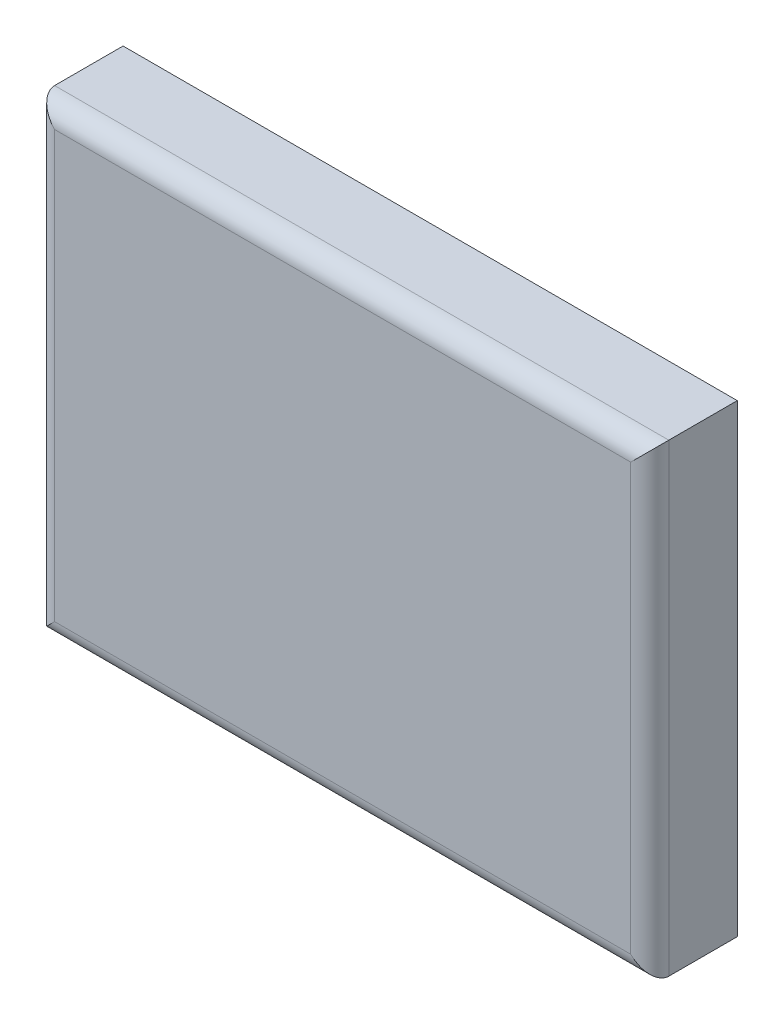
ISO-10303-21;
HEADER;
FILE_DESCRIPTION(('STEP AP214'),'2;1');
FILE_NAME('part.step','',(''),(''),'','','');
FILE_SCHEMA(('AUTOMOTIVE_DESIGN { 1 0 10303 214 1 1 1 1 }'));
ENDSEC;
DATA;
#1=APPLICATION_CONTEXT('core data for automotive mechanical design processes');
#2=APPLICATION_PROTOCOL_DEFINITION('international standard','automotive_design',2000,#1);
#3=PRODUCT_CONTEXT('',#1,'mechanical');
#4=PRODUCT('Part','Part','',(#3));
#5=PRODUCT_RELATED_PRODUCT_CATEGORY('part','',(#4));
#6=PRODUCT_DEFINITION_FORMATION('','',#4);
#7=PRODUCT_DEFINITION_CONTEXT('part definition',#1,'design');
#8=PRODUCT_DEFINITION('design','',#6,#7);
#9=PRODUCT_DEFINITION_SHAPE('','',#8);
#10=(LENGTH_UNIT() NAMED_UNIT(*) SI_UNIT(.MILLI.,.METRE.));
#11=(NAMED_UNIT(*) PLANE_ANGLE_UNIT() SI_UNIT($,.RADIAN.));
#12=(NAMED_UNIT(*) SI_UNIT($,.STERADIAN.) SOLID_ANGLE_UNIT());
#13=UNCERTAINTY_MEASURE_WITH_UNIT(LENGTH_MEASURE(1.E-05),#10,'distance_accuracy_value','');
#14=(GEOMETRIC_REPRESENTATION_CONTEXT(3) GLOBAL_UNCERTAINTY_ASSIGNED_CONTEXT((#13)) GLOBAL_UNIT_ASSIGNED_CONTEXT((#10,
#11,#12)) REPRESENTATION_CONTEXT('',''));
#15=CARTESIAN_POINT('',(0.,0.,0.));
#16=DIRECTION('',(0.,0.,1.));
#17=DIRECTION('',(1.,0.,0.));
#18=AXIS2_PLACEMENT_3D('',#15,#16,#17);
#19=CARTESIAN_POINT('',(8.07,-6.1,2.3));
#20=DIRECTION('',(-1.,0.,0.));
#21=DIRECTION('',(0.,0.,1.));
#22=AXIS2_PLACEMENT_3D('',#19,#20,#21);
#23=PLANE('',#22);
#24=DIRECTION('',(0.,0.,-1.));
#25=VECTOR('',#24,1.);
#26=CARTESIAN_POINT('',(8.07,6.1,2.3));
#27=LINE('',#26,#25);
#28=CARTESIAN_POINT('',(8.07,6.1,1.8));
#29=VERTEX_POINT('',#28);
#30=CARTESIAN_POINT('',(8.07,6.1,0.));
#31=VERTEX_POINT('',#30);
#32=EDGE_CURVE('E86',#29,#31,#27,.T.);
#33=ORIENTED_EDGE('',*,*,#32,.F.);
#34=DIRECTION('',(0.,1.,0.));
#35=VECTOR('',#34,1.);
#36=CARTESIAN_POINT('',(8.07,-6.1,1.8));
#37=LINE('',#36,#35);
#38=CARTESIAN_POINT('',(8.07,-6.1,1.8));
#39=VERTEX_POINT('',#38);
#40=EDGE_CURVE('E11',#29,#39,#37,.F.);
#41=ORIENTED_EDGE('',*,*,#40,.T.);
#42=DIRECTION('',(0.,0.,-1.));
#43=VECTOR('',#42,1.);
#44=CARTESIAN_POINT('',(8.07,-6.1,2.3));
#45=LINE('',#44,#43);
#46=CARTESIAN_POINT('',(8.07,-6.1,0.));
#47=VERTEX_POINT('',#46);
#48=EDGE_CURVE('E106',#39,#47,#45,.T.);
#49=ORIENTED_EDGE('',*,*,#48,.T.);
#50=DIRECTION('',(0.,1.,0.));
#51=VECTOR('',#50,1.);
#52=CARTESIAN_POINT('',(8.07,-6.1,0.));
#53=LINE('',#52,#51);
#54=EDGE_CURVE('E101',#47,#31,#53,.T.);
#55=ORIENTED_EDGE('',*,*,#54,.T.);
#56=EDGE_LOOP('',(#33,#41,#49,#55));
#57=FACE_BOUND('',#56,.T.);
#58=ADVANCED_FACE('F34',(#57),#23,.F.);
#59=CARTESIAN_POINT('',(-8.07,6.1,2.3));
#60=DIRECTION('',(0.,-1.,0.));
#61=DIRECTION('',(0.,0.,-1.));
#62=AXIS2_PLACEMENT_3D('',#59,#60,#61);
#63=PLANE('',#62);
#64=DIRECTION('',(0.,0.,-1.));
#65=VECTOR('',#64,1.);
#66=CARTESIAN_POINT('',(-8.07,6.1,2.3));
#67=LINE('',#66,#65);
#68=CARTESIAN_POINT('',(-8.07,6.1,1.8));
#69=VERTEX_POINT('',#68);
#70=CARTESIAN_POINT('',(-8.07,6.1,0.));
#71=VERTEX_POINT('',#70);
#72=EDGE_CURVE('E95',#69,#71,#67,.T.);
#73=ORIENTED_EDGE('',*,*,#72,.F.);
#74=DIRECTION('',(-1.,0.,0.));
#75=VECTOR('',#74,1.);
#76=CARTESIAN_POINT('',(-8.07,6.1,1.8));
#77=LINE('',#76,#75);
#78=EDGE_CURVE('E43',#69,#29,#77,.F.);
#79=ORIENTED_EDGE('',*,*,#78,.T.);
#80=ORIENTED_EDGE('',*,*,#32,.T.);
#81=DIRECTION('',(-1.,0.,0.));
#82=VECTOR('',#81,1.);
#83=CARTESIAN_POINT('',(-8.07,6.1,0.));
#84=LINE('',#83,#82);
#85=EDGE_CURVE('E89',#31,#71,#84,.T.);
#86=ORIENTED_EDGE('',*,*,#85,.T.);
#87=EDGE_LOOP('',(#73,#79,#80,#86));
#88=FACE_BOUND('',#87,.T.);
#89=ADVANCED_FACE('F88',(#88),#63,.F.);
#90=CARTESIAN_POINT('',(-8.07,-6.1,2.3));
#91=DIRECTION('',(1.,0.,0.));
#92=DIRECTION('',(0.,0.,-1.));
#93=AXIS2_PLACEMENT_3D('',#90,#91,#92);
#94=PLANE('',#93);
#95=DIRECTION('',(0.,0.,-1.));
#96=VECTOR('',#95,1.);
#97=CARTESIAN_POINT('',(-8.07,-6.1,2.3));
#98=LINE('',#97,#96);
#99=CARTESIAN_POINT('',(-8.07,-6.1,1.8));
#100=VERTEX_POINT('',#99);
#101=CARTESIAN_POINT('',(-8.07,-6.1,0.));
#102=VERTEX_POINT('',#101);
#103=EDGE_CURVE('E116',#100,#102,#98,.T.);
#104=ORIENTED_EDGE('',*,*,#103,.F.);
#105=DIRECTION('',(0.,-1.,0.));
#106=VECTOR('',#105,1.);
#107=CARTESIAN_POINT('',(-8.07,-6.1,1.8));
#108=LINE('',#107,#106);
#109=EDGE_CURVE('E58',#100,#69,#108,.F.);
#110=ORIENTED_EDGE('',*,*,#109,.T.);
#111=ORIENTED_EDGE('',*,*,#72,.T.);
#112=DIRECTION('',(0.,-1.,0.));
#113=VECTOR('',#112,1.);
#114=CARTESIAN_POINT('',(-8.07,-6.1,0.));
#115=LINE('',#114,#113);
#116=EDGE_CURVE('E103',#71,#102,#115,.T.);
#117=ORIENTED_EDGE('',*,*,#116,.T.);
#118=EDGE_LOOP('',(#104,#110,#111,#117));
#119=FACE_BOUND('',#118,.T.);
#120=ADVANCED_FACE('F154',(#119),#94,.F.);
#121=CARTESIAN_POINT('',(-8.07,-6.1,2.3));
#122=DIRECTION('',(0.,1.,0.));
#123=DIRECTION('',(0.,0.,1.));
#124=AXIS2_PLACEMENT_3D('',#121,#122,#123);
#125=PLANE('',#124);
#126=ORIENTED_EDGE('',*,*,#48,.F.);
#127=DIRECTION('',(1.,0.,0.));
#128=VECTOR('',#127,1.);
#129=CARTESIAN_POINT('',(-8.07,-6.1,1.8));
#130=LINE('',#129,#128);
#131=EDGE_CURVE('E127',#39,#100,#130,.F.);
#132=ORIENTED_EDGE('',*,*,#131,.T.);
#133=ORIENTED_EDGE('',*,*,#103,.T.);
#134=DIRECTION('',(1.,0.,0.));
#135=VECTOR('',#134,1.);
#136=CARTESIAN_POINT('',(-8.07,-6.1,0.));
#137=LINE('',#136,#135);
#138=EDGE_CURVE('E113',#102,#47,#137,.T.);
#139=ORIENTED_EDGE('',*,*,#138,.T.);
#140=EDGE_LOOP('',(#126,#132,#133,#139));
#141=FACE_BOUND('',#140,.T.);
#142=ADVANCED_FACE('F153',(#141),#125,.F.);
#143=CARTESIAN_POINT('',(0.,0.,2.3));
#144=DIRECTION('',(0.,0.,-1.));
#145=DIRECTION('',(-1.,0.,0.));
#146=AXIS2_PLACEMENT_3D('',#143,#144,#145);
#147=PLANE('',#146);
#148=DIRECTION('',(0.,-1.,0.));
#149=VECTOR('',#148,1.);
#150=CARTESIAN_POINT('',(-7.57,0.,2.3));
#151=LINE('',#150,#149);
#152=CARTESIAN_POINT('',(-7.57,5.6,2.3));
#153=VERTEX_POINT('',#152);
#154=CARTESIAN_POINT('',(-7.57,-5.6,2.3));
#155=VERTEX_POINT('',#154);
#156=EDGE_CURVE('E122',#153,#155,#151,.T.);
#157=ORIENTED_EDGE('',*,*,#156,.T.);
#158=DIRECTION('',(1.,0.,0.));
#159=VECTOR('',#158,1.);
#160=CARTESIAN_POINT('',(0.,-5.6,2.3));
#161=LINE('',#160,#159);
#162=CARTESIAN_POINT('',(7.57,-5.6,2.3));
#163=VERTEX_POINT('',#162);
#164=EDGE_CURVE('E124',#155,#163,#161,.T.);
#165=ORIENTED_EDGE('',*,*,#164,.T.);
#166=DIRECTION('',(0.,1.,0.));
#167=VECTOR('',#166,1.);
#168=CARTESIAN_POINT('',(7.57,0.,2.3));
#169=LINE('',#168,#167);
#170=CARTESIAN_POINT('',(7.57,5.6,2.3));
#171=VERTEX_POINT('',#170);
#172=EDGE_CURVE('E94',#163,#171,#169,.T.);
#173=ORIENTED_EDGE('',*,*,#172,.T.);
#174=DIRECTION('',(-1.,0.,0.));
#175=VECTOR('',#174,1.);
#176=CARTESIAN_POINT('',(0.,5.6,2.3));
#177=LINE('',#176,#175);
#178=EDGE_CURVE('E120',#171,#153,#177,.T.);
#179=ORIENTED_EDGE('',*,*,#178,.T.);
#180=EDGE_LOOP('',(#157,#165,#173,#179));
#181=FACE_BOUND('',#180,.T.);
#182=ADVANCED_FACE('F146',(#181),#147,.F.);
#183=CARTESIAN_POINT('',(0.,0.,0.));
#184=DIRECTION('',(0.,0.,-1.));
#185=DIRECTION('',(-1.,0.,0.));
#186=AXIS2_PLACEMENT_3D('',#183,#184,#185);
#187=PLANE('',#186);
#188=ORIENTED_EDGE('',*,*,#54,.F.);
#189=ORIENTED_EDGE('',*,*,#138,.F.);
#190=ORIENTED_EDGE('',*,*,#116,.F.);
#191=ORIENTED_EDGE('',*,*,#85,.F.);
#192=EDGE_LOOP('',(#188,#189,#190,#191));
#193=FACE_BOUND('',#192,.T.);
#194=ADVANCED_FACE('F99',(#193),#187,.T.);
#195=CARTESIAN_POINT('',(0.,5.6,1.8));
#196=DIRECTION('',(-1.,0.,0.));
#197=DIRECTION('',(0.,0.,1.));
#198=AXIS2_PLACEMENT_3D('',#195,#196,#197);
#199=CYLINDRICAL_SURFACE('',#198,0.5);
#200=CARTESIAN_POINT('',(7.57,5.6,1.8));
#201=DIRECTION('',(-0.707106781186547,0.707106781186547,0.));
#202=DIRECTION('',(0.707106781186547,0.707106781186547,0.));
#203=AXIS2_PLACEMENT_3D('',#200,#201,#202);
#204=ELLIPSE('',#203,0.707106781186547,0.5);
#205=EDGE_CURVE('E110',#29,#171,#204,.F.);
#206=ORIENTED_EDGE('',*,*,#205,.F.);
#207=ORIENTED_EDGE('',*,*,#78,.F.);
#208=CARTESIAN_POINT('',(-7.57,5.6,1.8));
#209=DIRECTION('',(-0.707106781186547,-0.707106781186547,0.));
#210=DIRECTION('',(-0.707106781186547,0.707106781186547,0.));
#211=AXIS2_PLACEMENT_3D('',#208,#209,#210);
#212=ELLIPSE('',#211,0.707106781186547,0.5);
#213=EDGE_CURVE('E38',#153,#69,#212,.T.);
#214=ORIENTED_EDGE('',*,*,#213,.F.);
#215=ORIENTED_EDGE('',*,*,#178,.F.);
#216=EDGE_LOOP('',(#206,#207,#214,#215));
#217=FACE_BOUND('',#216,.T.);
#218=ADVANCED_FACE('F36',(#217),#199,.T.);
#219=CARTESIAN_POINT('',(-7.57,0.,1.8));
#220=DIRECTION('',(0.,-1.,0.));
#221=DIRECTION('',(0.,0.,-1.));
#222=AXIS2_PLACEMENT_3D('',#219,#220,#221);
#223=CYLINDRICAL_SURFACE('',#222,0.5);
#224=ORIENTED_EDGE('',*,*,#213,.T.);
#225=ORIENTED_EDGE('',*,*,#109,.F.);
#226=CARTESIAN_POINT('',(-7.57,-5.6,1.8));
#227=DIRECTION('',(0.707106781186547,-0.707106781186547,0.));
#228=DIRECTION('',(-0.707106781186547,-0.707106781186547,0.));
#229=AXIS2_PLACEMENT_3D('',#226,#227,#228);
#230=ELLIPSE('',#229,0.707106781186547,0.5);
#231=EDGE_CURVE('E134',#155,#100,#230,.T.);
#232=ORIENTED_EDGE('',*,*,#231,.F.);
#233=ORIENTED_EDGE('',*,*,#156,.F.);
#234=EDGE_LOOP('',(#224,#225,#232,#233));
#235=FACE_BOUND('',#234,.T.);
#236=ADVANCED_FACE('F171',(#235),#223,.T.);
#237=CARTESIAN_POINT('',(7.57,0.,1.8));
#238=DIRECTION('',(0.,1.,0.));
#239=DIRECTION('',(0.,0.,1.));
#240=AXIS2_PLACEMENT_3D('',#237,#238,#239);
#241=CYLINDRICAL_SURFACE('',#240,0.5);
#242=ORIENTED_EDGE('',*,*,#205,.T.);
#243=ORIENTED_EDGE('',*,*,#172,.F.);
#244=CARTESIAN_POINT('',(7.57,-5.6,1.8));
#245=DIRECTION('',(0.707106781186547,0.707106781186547,0.));
#246=DIRECTION('',(-0.707106781186547,0.707106781186547,0.));
#247=AXIS2_PLACEMENT_3D('',#244,#245,#246);
#248=ELLIPSE('',#247,0.707106781186547,0.5);
#249=EDGE_CURVE('E132',#39,#163,#248,.F.);
#250=ORIENTED_EDGE('',*,*,#249,.F.);
#251=ORIENTED_EDGE('',*,*,#40,.F.);
#252=EDGE_LOOP('',(#242,#243,#250,#251));
#253=FACE_BOUND('',#252,.T.);
#254=ADVANCED_FACE('F139',(#253),#241,.T.);
#255=CARTESIAN_POINT('',(0.,-5.6,1.8));
#256=DIRECTION('',(1.,0.,0.));
#257=DIRECTION('',(0.,0.,-1.));
#258=AXIS2_PLACEMENT_3D('',#255,#256,#257);
#259=CYLINDRICAL_SURFACE('',#258,0.5);
#260=ORIENTED_EDGE('',*,*,#231,.T.);
#261=ORIENTED_EDGE('',*,*,#131,.F.);
#262=ORIENTED_EDGE('',*,*,#249,.T.);
#263=ORIENTED_EDGE('',*,*,#164,.F.);
#264=EDGE_LOOP('',(#260,#261,#262,#263));
#265=FACE_BOUND('',#264,.T.);
#266=ADVANCED_FACE('F150',(#265),#259,.T.);
#267=CLOSED_SHELL('',(#58,#89,#120,#142,#182,#194,#218,#236,#254,#266));
#268=MANIFOLD_SOLID_BREP('B2',#267);
#269=ADVANCED_BREP_SHAPE_REPRESENTATION('',(#18,#268),#14);
#270=SHAPE_DEFINITION_REPRESENTATION(#9,#269);
ENDSEC;
END-ISO-10303-21;
